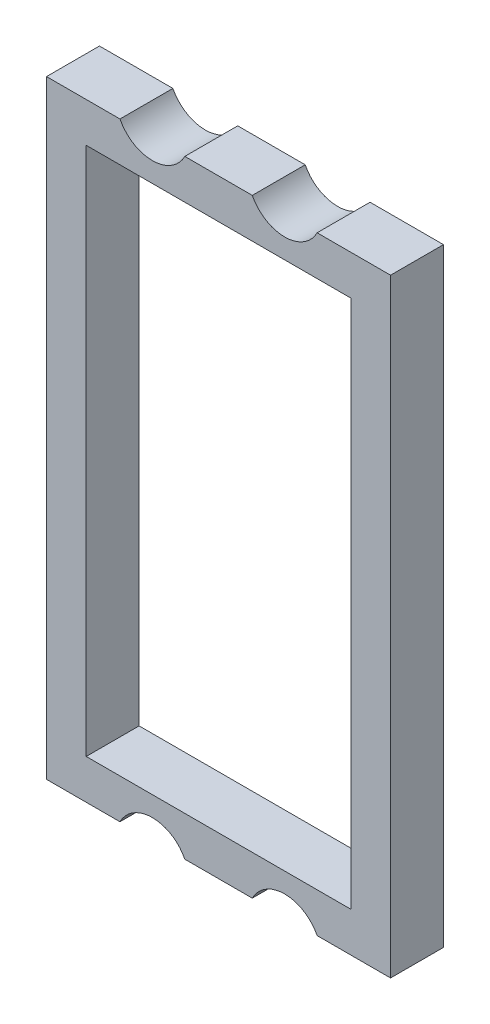
ISO-10303-21;
HEADER;
FILE_DESCRIPTION(('STEP AP214'),'2;1');
FILE_NAME('part.step','',(''),(''),'','','');
FILE_SCHEMA(('AUTOMOTIVE_DESIGN { 1 0 10303 214 1 1 1 1 }'));
ENDSEC;
DATA;
#1=APPLICATION_CONTEXT('core data for automotive mechanical design processes');
#2=APPLICATION_PROTOCOL_DEFINITION('international standard','automotive_design',2000,#1);
#3=PRODUCT_CONTEXT('',#1,'mechanical');
#4=PRODUCT('Part','Part','',(#3));
#5=PRODUCT_RELATED_PRODUCT_CATEGORY('part','',(#4));
#6=PRODUCT_DEFINITION_FORMATION('','',#4);
#7=PRODUCT_DEFINITION_CONTEXT('part definition',#1,'design');
#8=PRODUCT_DEFINITION('design','',#6,#7);
#9=PRODUCT_DEFINITION_SHAPE('','',#8);
#10=(LENGTH_UNIT() NAMED_UNIT(*) SI_UNIT(.MILLI.,.METRE.));
#11=(NAMED_UNIT(*) PLANE_ANGLE_UNIT() SI_UNIT($,.RADIAN.));
#12=(NAMED_UNIT(*) SI_UNIT($,.STERADIAN.) SOLID_ANGLE_UNIT());
#13=UNCERTAINTY_MEASURE_WITH_UNIT(LENGTH_MEASURE(1.E-05),#10,'distance_accuracy_value','');
#14=(GEOMETRIC_REPRESENTATION_CONTEXT(3) GLOBAL_UNCERTAINTY_ASSIGNED_CONTEXT((#13)) GLOBAL_UNIT_ASSIGNED_CONTEXT((#10,
#11,#12)) REPRESENTATION_CONTEXT('',''));
#15=CARTESIAN_POINT('',(0.,0.,0.));
#16=DIRECTION('',(0.,0.,1.));
#17=DIRECTION('',(1.,0.,0.));
#18=AXIS2_PLACEMENT_3D('',#15,#16,#17);
#19=CARTESIAN_POINT('',(0.,0.,0.));
#20=DIRECTION('',(0.,0.,1.));
#21=DIRECTION('',(0.,-1.,0.));
#22=AXIS2_PLACEMENT_3D('',#19,#20,#21);
#23=PLANE('',#22);
#24=DIRECTION('',(0.,1.,0.));
#25=VECTOR('',#24,1.);
#26=CARTESIAN_POINT('',(13.,-23.,0.));
#27=LINE('',#26,#25);
#28=CARTESIAN_POINT('',(13.,-23.,0.));
#29=VERTEX_POINT('',#28);
#30=CARTESIAN_POINT('',(13.,23.,0.));
#31=VERTEX_POINT('',#30);
#32=EDGE_CURVE('E25',#29,#31,#27,.T.);
#33=ORIENTED_EDGE('',*,*,#32,.F.);
#34=DIRECTION('',(1.,0.,0.));
#35=VECTOR('',#34,1.);
#36=CARTESIAN_POINT('',(7.44948974278318,-23.,0.));
#37=LINE('',#36,#35);
#38=CARTESIAN_POINT('',(7.44948974278318,-23.,0.));
#39=VERTEX_POINT('',#38);
#40=EDGE_CURVE('E34',#39,#29,#37,.T.);
#41=ORIENTED_EDGE('',*,*,#40,.F.);
#42=CARTESIAN_POINT('',(5.,-24.25,0.));
#43=DIRECTION('',(0.,0.,-1.));
#44=DIRECTION('',(-0.890723542830246,0.454545454545457,0.));
#45=AXIS2_PLACEMENT_3D('',#42,#43,#44);
#46=CIRCLE('',#45,2.75);
#47=CARTESIAN_POINT('',(2.55051025721682,-23.,0.));
#48=VERTEX_POINT('',#47);
#49=EDGE_CURVE('E185',#48,#39,#46,.T.);
#50=ORIENTED_EDGE('',*,*,#49,.F.);
#51=DIRECTION('',(1.,0.,0.));
#52=VECTOR('',#51,1.);
#53=CARTESIAN_POINT('',(-2.55051025721682,-23.,0.));
#54=LINE('',#53,#52);
#55=CARTESIAN_POINT('',(-2.55051025721682,-23.,0.));
#56=VERTEX_POINT('',#55);
#57=EDGE_CURVE('E190',#56,#48,#54,.T.);
#58=ORIENTED_EDGE('',*,*,#57,.F.);
#59=CARTESIAN_POINT('',(-5.,-24.25,0.));
#60=DIRECTION('',(0.,0.,-1.));
#61=DIRECTION('',(-0.890723542830245,0.454545454545458,0.));
#62=AXIS2_PLACEMENT_3D('',#59,#60,#61);
#63=CIRCLE('',#62,2.75);
#64=CARTESIAN_POINT('',(-7.44948974278318,-23.,0.));
#65=VERTEX_POINT('',#64);
#66=EDGE_CURVE('E198',#65,#56,#63,.T.);
#67=ORIENTED_EDGE('',*,*,#66,.F.);
#68=DIRECTION('',(1.,0.,0.));
#69=VECTOR('',#68,1.);
#70=CARTESIAN_POINT('',(-13.,-23.,0.));
#71=LINE('',#70,#69);
#72=CARTESIAN_POINT('',(-13.,-23.,0.));
#73=VERTEX_POINT('',#72);
#74=EDGE_CURVE('E214',#73,#65,#71,.T.);
#75=ORIENTED_EDGE('',*,*,#74,.F.);
#76=DIRECTION('',(0.,-1.,0.));
#77=VECTOR('',#76,1.);
#78=CARTESIAN_POINT('',(-13.,23.,0.));
#79=LINE('',#78,#77);
#80=CARTESIAN_POINT('',(-13.,23.,0.));
#81=VERTEX_POINT('',#80);
#82=EDGE_CURVE('E219',#81,#73,#79,.T.);
#83=ORIENTED_EDGE('',*,*,#82,.F.);
#84=DIRECTION('',(-1.,0.,0.));
#85=VECTOR('',#84,1.);
#86=CARTESIAN_POINT('',(-7.44948974278318,23.,0.));
#87=LINE('',#86,#85);
#88=CARTESIAN_POINT('',(-7.44948974278318,23.,0.));
#89=VERTEX_POINT('',#88);
#90=EDGE_CURVE('E277',#89,#81,#87,.T.);
#91=ORIENTED_EDGE('',*,*,#90,.F.);
#92=CARTESIAN_POINT('',(-5.,24.25,0.));
#93=DIRECTION('',(0.,0.,-1.));
#94=DIRECTION('',(0.890723542830245,-0.454545454545458,0.));
#95=AXIS2_PLACEMENT_3D('',#92,#93,#94);
#96=CIRCLE('',#95,2.75);
#97=CARTESIAN_POINT('',(-2.55051025721682,23.,0.));
#98=VERTEX_POINT('',#97);
#99=EDGE_CURVE('E228',#98,#89,#96,.T.);
#100=ORIENTED_EDGE('',*,*,#99,.F.);
#101=DIRECTION('',(-1.,0.,0.));
#102=VECTOR('',#101,1.);
#103=CARTESIAN_POINT('',(2.55051025721682,23.,0.));
#104=LINE('',#103,#102);
#105=CARTESIAN_POINT('',(2.55051025721682,23.,0.));
#106=VERTEX_POINT('',#105);
#107=EDGE_CURVE('E179',#106,#98,#104,.T.);
#108=ORIENTED_EDGE('',*,*,#107,.F.);
#109=CARTESIAN_POINT('',(5.,24.25,0.));
#110=DIRECTION('',(0.,0.,-1.));
#111=DIRECTION('',(0.890723542830245,-0.454545454545458,0.));
#112=AXIS2_PLACEMENT_3D('',#109,#110,#111);
#113=CIRCLE('',#112,2.75);
#114=CARTESIAN_POINT('',(7.44948974278318,23.,0.));
#115=VERTEX_POINT('',#114);
#116=EDGE_CURVE('E180',#115,#106,#113,.T.);
#117=ORIENTED_EDGE('',*,*,#116,.F.);
#118=DIRECTION('',(-1.,0.,0.));
#119=VECTOR('',#118,1.);
#120=CARTESIAN_POINT('',(13.,23.,0.));
#121=LINE('',#120,#119);
#122=EDGE_CURVE('E224',#31,#115,#121,.T.);
#123=ORIENTED_EDGE('',*,*,#122,.F.);
#124=EDGE_LOOP('',(#33,#41,#50,#58,#67,#75,#83,#91,#100,#108,#117,#123));
#125=FACE_BOUND('',#124,.T.);
#126=DIRECTION('',(-1.,0.,0.));
#127=VECTOR('',#126,1.);
#128=CARTESIAN_POINT('',(10.,-20.,0.));
#129=LINE('',#128,#127);
#130=CARTESIAN_POINT('',(10.,-20.,0.));
#131=VERTEX_POINT('',#130);
#132=CARTESIAN_POINT('',(-10.,-20.,0.));
#133=VERTEX_POINT('',#132);
#134=EDGE_CURVE('E268',#131,#133,#129,.T.);
#135=ORIENTED_EDGE('',*,*,#134,.F.);
#136=DIRECTION('',(0.,-1.,0.));
#137=VECTOR('',#136,1.);
#138=CARTESIAN_POINT('',(10.,20.,0.));
#139=LINE('',#138,#137);
#140=CARTESIAN_POINT('',(10.,20.,0.));
#141=VERTEX_POINT('',#140);
#142=EDGE_CURVE('E157',#141,#131,#139,.T.);
#143=ORIENTED_EDGE('',*,*,#142,.F.);
#144=DIRECTION('',(1.,0.,0.));
#145=VECTOR('',#144,1.);
#146=CARTESIAN_POINT('',(-10.,20.,0.));
#147=LINE('',#146,#145);
#148=CARTESIAN_POINT('',(-10.,20.,0.));
#149=VERTEX_POINT('',#148);
#150=EDGE_CURVE('E154',#149,#141,#147,.T.);
#151=ORIENTED_EDGE('',*,*,#150,.F.);
#152=DIRECTION('',(0.,1.,0.));
#153=VECTOR('',#152,1.);
#154=CARTESIAN_POINT('',(-10.,-20.,0.));
#155=LINE('',#154,#153);
#156=EDGE_CURVE('E201',#133,#149,#155,.T.);
#157=ORIENTED_EDGE('',*,*,#156,.F.);
#158=EDGE_LOOP('',(#135,#143,#151,#157));
#159=FACE_BOUND('',#158,.T.);
#160=ADVANCED_FACE('F14',(#125,#159),#23,.F.);
#161=CARTESIAN_POINT('',(13.,-23.,0.));
#162=DIRECTION('',(1.,0.,0.));
#163=DIRECTION('',(0.,1.,0.));
#164=AXIS2_PLACEMENT_3D('',#161,#162,#163);
#165=PLANE('',#164);
#166=DIRECTION('',(0.,0.,1.));
#167=VECTOR('',#166,1.);
#168=CARTESIAN_POINT('',(13.,23.,0.));
#169=LINE('',#168,#167);
#170=CARTESIAN_POINT('',(13.,23.,4.));
#171=VERTEX_POINT('',#170);
#172=EDGE_CURVE('E9',#31,#171,#169,.T.);
#173=ORIENTED_EDGE('',*,*,#172,.T.);
#174=DIRECTION('',(0.,1.,0.));
#175=VECTOR('',#174,1.);
#176=CARTESIAN_POINT('',(13.,-23.,4.));
#177=LINE('',#176,#175);
#178=CARTESIAN_POINT('',(13.,-23.,4.));
#179=VERTEX_POINT('',#178);
#180=EDGE_CURVE('E171',#179,#171,#177,.T.);
#181=ORIENTED_EDGE('',*,*,#180,.F.);
#182=DIRECTION('',(0.,0.,1.));
#183=VECTOR('',#182,1.);
#184=CARTESIAN_POINT('',(13.,-23.,0.));
#185=LINE('',#184,#183);
#186=EDGE_CURVE('E184',#29,#179,#185,.T.);
#187=ORIENTED_EDGE('',*,*,#186,.F.);
#188=ORIENTED_EDGE('',*,*,#32,.T.);
#189=EDGE_LOOP('',(#173,#181,#187,#188));
#190=FACE_BOUND('',#189,.T.);
#191=ADVANCED_FACE('F304',(#190),#165,.T.);
#192=CARTESIAN_POINT('',(7.44948974278318,-23.,0.));
#193=DIRECTION('',(0.,-1.,0.));
#194=DIRECTION('',(1.,0.,0.));
#195=AXIS2_PLACEMENT_3D('',#192,#193,#194);
#196=PLANE('',#195);
#197=ORIENTED_EDGE('',*,*,#186,.T.);
#198=DIRECTION('',(1.,0.,0.));
#199=VECTOR('',#198,1.);
#200=CARTESIAN_POINT('',(7.44948974278318,-23.,4.));
#201=LINE('',#200,#199);
#202=CARTESIAN_POINT('',(7.44948974278318,-23.,4.));
#203=VERTEX_POINT('',#202);
#204=EDGE_CURVE('E174',#203,#179,#201,.T.);
#205=ORIENTED_EDGE('',*,*,#204,.F.);
#206=DIRECTION('',(0.,0.,1.));
#207=VECTOR('',#206,1.);
#208=CARTESIAN_POINT('',(7.44948974278318,-23.,0.));
#209=LINE('',#208,#207);
#210=EDGE_CURVE('E188',#39,#203,#209,.T.);
#211=ORIENTED_EDGE('',*,*,#210,.F.);
#212=ORIENTED_EDGE('',*,*,#40,.T.);
#213=EDGE_LOOP('',(#197,#205,#211,#212));
#214=FACE_BOUND('',#213,.T.);
#215=ADVANCED_FACE('F309',(#214),#196,.T.);
#216=CARTESIAN_POINT('',(5.,-24.25,0.));
#217=DIRECTION('',(0.,0.,-1.));
#218=DIRECTION('',(0.,-1.,0.));
#219=AXIS2_PLACEMENT_3D('',#216,#217,#218);
#220=CYLINDRICAL_SURFACE('',#219,2.75);
#221=ORIENTED_EDGE('',*,*,#210,.T.);
#222=CARTESIAN_POINT('',(5.,-24.25,4.));
#223=DIRECTION('',(0.,0.,-1.));
#224=DIRECTION('',(-0.890723542830246,0.454545454545457,0.));
#225=AXIS2_PLACEMENT_3D('',#222,#223,#224);
#226=CIRCLE('',#225,2.75);
#227=CARTESIAN_POINT('',(2.55051025721682,-23.,4.));
#228=VERTEX_POINT('',#227);
#229=EDGE_CURVE('E55',#228,#203,#226,.T.);
#230=ORIENTED_EDGE('',*,*,#229,.F.);
#231=DIRECTION('',(0.,0.,1.));
#232=VECTOR('',#231,1.);
#233=CARTESIAN_POINT('',(2.55051025721682,-23.,0.));
#234=LINE('',#233,#232);
#235=EDGE_CURVE('E189',#48,#228,#234,.T.);
#236=ORIENTED_EDGE('',*,*,#235,.F.);
#237=ORIENTED_EDGE('',*,*,#49,.T.);
#238=EDGE_LOOP('',(#221,#230,#236,#237));
#239=FACE_BOUND('',#238,.T.);
#240=ADVANCED_FACE('F341',(#239),#220,.F.);
#241=CARTESIAN_POINT('',(-2.55051025721682,-23.,0.));
#242=DIRECTION('',(0.,-1.,0.));
#243=DIRECTION('',(1.,0.,0.));
#244=AXIS2_PLACEMENT_3D('',#241,#242,#243);
#245=PLANE('',#244);
#246=ORIENTED_EDGE('',*,*,#235,.T.);
#247=DIRECTION('',(1.,0.,0.));
#248=VECTOR('',#247,1.);
#249=CARTESIAN_POINT('',(-2.55051025721682,-23.,4.));
#250=LINE('',#249,#248);
#251=CARTESIAN_POINT('',(-2.55051025721682,-23.,4.));
#252=VERTEX_POINT('',#251);
#253=EDGE_CURVE('E66',#252,#228,#250,.T.);
#254=ORIENTED_EDGE('',*,*,#253,.F.);
#255=DIRECTION('',(0.,0.,1.));
#256=VECTOR('',#255,1.);
#257=CARTESIAN_POINT('',(-2.55051025721682,-23.,0.));
#258=LINE('',#257,#256);
#259=EDGE_CURVE('E193',#56,#252,#258,.T.);
#260=ORIENTED_EDGE('',*,*,#259,.F.);
#261=ORIENTED_EDGE('',*,*,#57,.T.);
#262=EDGE_LOOP('',(#246,#254,#260,#261));
#263=FACE_BOUND('',#262,.T.);
#264=ADVANCED_FACE('F346',(#263),#245,.T.);
#265=CARTESIAN_POINT('',(-5.,-24.25,0.));
#266=DIRECTION('',(0.,0.,-1.));
#267=DIRECTION('',(0.,-1.,0.));
#268=AXIS2_PLACEMENT_3D('',#265,#266,#267);
#269=CYLINDRICAL_SURFACE('',#268,2.75);
#270=ORIENTED_EDGE('',*,*,#259,.T.);
#271=CARTESIAN_POINT('',(-5.,-24.25,4.));
#272=DIRECTION('',(0.,0.,-1.));
#273=DIRECTION('',(-0.890723542830245,0.454545454545458,0.));
#274=AXIS2_PLACEMENT_3D('',#271,#272,#273);
#275=CIRCLE('',#274,2.75);
#276=CARTESIAN_POINT('',(-7.44948974278318,-23.,4.));
#277=VERTEX_POINT('',#276);
#278=EDGE_CURVE('E242',#277,#252,#275,.T.);
#279=ORIENTED_EDGE('',*,*,#278,.F.);
#280=DIRECTION('',(0.,0.,1.));
#281=VECTOR('',#280,1.);
#282=CARTESIAN_POINT('',(-7.44948974278318,-23.,0.));
#283=LINE('',#282,#281);
#284=EDGE_CURVE('E210',#65,#277,#283,.T.);
#285=ORIENTED_EDGE('',*,*,#284,.F.);
#286=ORIENTED_EDGE('',*,*,#66,.T.);
#287=EDGE_LOOP('',(#270,#279,#285,#286));
#288=FACE_BOUND('',#287,.T.);
#289=ADVANCED_FACE('F366',(#288),#269,.F.);
#290=CARTESIAN_POINT('',(-13.,-23.,0.));
#291=DIRECTION('',(0.,-1.,0.));
#292=DIRECTION('',(1.,0.,0.));
#293=AXIS2_PLACEMENT_3D('',#290,#291,#292);
#294=PLANE('',#293);
#295=ORIENTED_EDGE('',*,*,#284,.T.);
#296=DIRECTION('',(1.,0.,0.));
#297=VECTOR('',#296,1.);
#298=CARTESIAN_POINT('',(-13.,-23.,4.));
#299=LINE('',#298,#297);
#300=CARTESIAN_POINT('',(-13.,-23.,4.));
#301=VERTEX_POINT('',#300);
#302=EDGE_CURVE('E246',#301,#277,#299,.T.);
#303=ORIENTED_EDGE('',*,*,#302,.F.);
#304=DIRECTION('',(0.,0.,1.));
#305=VECTOR('',#304,1.);
#306=CARTESIAN_POINT('',(-13.,-23.,0.));
#307=LINE('',#306,#305);
#308=EDGE_CURVE('E215',#73,#301,#307,.T.);
#309=ORIENTED_EDGE('',*,*,#308,.F.);
#310=ORIENTED_EDGE('',*,*,#74,.T.);
#311=EDGE_LOOP('',(#295,#303,#309,#310));
#312=FACE_BOUND('',#311,.T.);
#313=ADVANCED_FACE('F360',(#312),#294,.T.);
#314=CARTESIAN_POINT('',(-13.,23.,0.));
#315=DIRECTION('',(-1.,0.,0.));
#316=DIRECTION('',(0.,-1.,0.));
#317=AXIS2_PLACEMENT_3D('',#314,#315,#316);
#318=PLANE('',#317);
#319=ORIENTED_EDGE('',*,*,#308,.T.);
#320=DIRECTION('',(0.,-1.,0.));
#321=VECTOR('',#320,1.);
#322=CARTESIAN_POINT('',(-13.,23.,4.));
#323=LINE('',#322,#321);
#324=CARTESIAN_POINT('',(-13.,23.,4.));
#325=VERTEX_POINT('',#324);
#326=EDGE_CURVE('E251',#325,#301,#323,.T.);
#327=ORIENTED_EDGE('',*,*,#326,.F.);
#328=DIRECTION('',(0.,0.,1.));
#329=VECTOR('',#328,1.);
#330=CARTESIAN_POINT('',(-13.,23.,0.));
#331=LINE('',#330,#329);
#332=EDGE_CURVE('E257',#81,#325,#331,.T.);
#333=ORIENTED_EDGE('',*,*,#332,.F.);
#334=ORIENTED_EDGE('',*,*,#82,.T.);
#335=EDGE_LOOP('',(#319,#327,#333,#334));
#336=FACE_BOUND('',#335,.T.);
#337=ADVANCED_FACE('F365',(#336),#318,.T.);
#338=CARTESIAN_POINT('',(-7.44948974278318,23.,0.));
#339=DIRECTION('',(0.,1.,0.));
#340=DIRECTION('',(-1.,0.,0.));
#341=AXIS2_PLACEMENT_3D('',#338,#339,#340);
#342=PLANE('',#341);
#343=ORIENTED_EDGE('',*,*,#332,.T.);
#344=DIRECTION('',(-1.,0.,0.));
#345=VECTOR('',#344,1.);
#346=CARTESIAN_POINT('',(-7.44948974278318,23.,4.));
#347=LINE('',#346,#345);
#348=CARTESIAN_POINT('',(-7.44948974278318,23.,4.));
#349=VERTEX_POINT('',#348);
#350=EDGE_CURVE('E254',#349,#325,#347,.T.);
#351=ORIENTED_EDGE('',*,*,#350,.F.);
#352=DIRECTION('',(0.,0.,1.));
#353=VECTOR('',#352,1.);
#354=CARTESIAN_POINT('',(-7.44948974278318,23.,0.));
#355=LINE('',#354,#353);
#356=EDGE_CURVE('E276',#89,#349,#355,.T.);
#357=ORIENTED_EDGE('',*,*,#356,.F.);
#358=ORIENTED_EDGE('',*,*,#90,.T.);
#359=EDGE_LOOP('',(#343,#351,#357,#358));
#360=FACE_BOUND('',#359,.T.);
#361=ADVANCED_FACE('F389',(#360),#342,.T.);
#362=CARTESIAN_POINT('',(-5.,24.25,0.));
#363=DIRECTION('',(0.,0.,-1.));
#364=DIRECTION('',(0.,-1.,0.));
#365=AXIS2_PLACEMENT_3D('',#362,#363,#364);
#366=CYLINDRICAL_SURFACE('',#365,2.75);
#367=ORIENTED_EDGE('',*,*,#356,.T.);
#368=CARTESIAN_POINT('',(-5.,24.25,4.));
#369=DIRECTION('',(0.,0.,-1.));
#370=DIRECTION('',(0.890723542830245,-0.454545454545458,0.));
#371=AXIS2_PLACEMENT_3D('',#368,#369,#370);
#372=CIRCLE('',#371,2.75);
#373=CARTESIAN_POINT('',(-2.55051025721682,23.,4.));
#374=VERTEX_POINT('',#373);
#375=EDGE_CURVE('E259',#374,#349,#372,.T.);
#376=ORIENTED_EDGE('',*,*,#375,.F.);
#377=DIRECTION('',(0.,0.,1.));
#378=VECTOR('',#377,1.);
#379=CARTESIAN_POINT('',(-2.55051025721682,23.,0.));
#380=LINE('',#379,#378);
#381=EDGE_CURVE('E209',#98,#374,#380,.T.);
#382=ORIENTED_EDGE('',*,*,#381,.F.);
#383=ORIENTED_EDGE('',*,*,#99,.T.);
#384=EDGE_LOOP('',(#367,#376,#382,#383));
#385=FACE_BOUND('',#384,.T.);
#386=ADVANCED_FACE('F16',(#385),#366,.F.);
#387=CARTESIAN_POINT('',(2.55051025721682,23.,0.));
#388=DIRECTION('',(0.,1.,0.));
#389=DIRECTION('',(-1.,0.,0.));
#390=AXIS2_PLACEMENT_3D('',#387,#388,#389);
#391=PLANE('',#390);
#392=ORIENTED_EDGE('',*,*,#381,.T.);
#393=DIRECTION('',(-1.,0.,0.));
#394=VECTOR('',#393,1.);
#395=CARTESIAN_POINT('',(2.55051025721682,23.,4.));
#396=LINE('',#395,#394);
#397=CARTESIAN_POINT('',(2.55051025721682,23.,4.));
#398=VERTEX_POINT('',#397);
#399=EDGE_CURVE('E263',#398,#374,#396,.T.);
#400=ORIENTED_EDGE('',*,*,#399,.F.);
#401=DIRECTION('',(0.,0.,1.));
#402=VECTOR('',#401,1.);
#403=CARTESIAN_POINT('',(2.55051025721682,23.,0.));
#404=LINE('',#403,#402);
#405=EDGE_CURVE('E176',#106,#398,#404,.T.);
#406=ORIENTED_EDGE('',*,*,#405,.F.);
#407=ORIENTED_EDGE('',*,*,#107,.T.);
#408=EDGE_LOOP('',(#392,#400,#406,#407));
#409=FACE_BOUND('',#408,.T.);
#410=ADVANCED_FACE('F323',(#409),#391,.T.);
#411=CARTESIAN_POINT('',(5.,24.25,0.));
#412=DIRECTION('',(0.,0.,-1.));
#413=DIRECTION('',(0.,-1.,0.));
#414=AXIS2_PLACEMENT_3D('',#411,#412,#413);
#415=CYLINDRICAL_SURFACE('',#414,2.75);
#416=ORIENTED_EDGE('',*,*,#405,.T.);
#417=CARTESIAN_POINT('',(5.,24.25,4.));
#418=DIRECTION('',(0.,0.,-1.));
#419=DIRECTION('',(0.890723542830245,-0.454545454545458,0.));
#420=AXIS2_PLACEMENT_3D('',#417,#418,#419);
#421=CIRCLE('',#420,2.75);
#422=CARTESIAN_POINT('',(7.44948974278318,23.,4.));
#423=VERTEX_POINT('',#422);
#424=EDGE_CURVE('E206',#423,#398,#421,.T.);
#425=ORIENTED_EDGE('',*,*,#424,.F.);
#426=DIRECTION('',(0.,0.,1.));
#427=VECTOR('',#426,1.);
#428=CARTESIAN_POINT('',(7.44948974278318,23.,0.));
#429=LINE('',#428,#427);
#430=EDGE_CURVE('E220',#115,#423,#429,.T.);
#431=ORIENTED_EDGE('',*,*,#430,.F.);
#432=ORIENTED_EDGE('',*,*,#116,.T.);
#433=EDGE_LOOP('',(#416,#425,#431,#432));
#434=FACE_BOUND('',#433,.T.);
#435=ADVANCED_FACE('F317',(#434),#415,.F.);
#436=CARTESIAN_POINT('',(13.,23.,0.));
#437=DIRECTION('',(0.,1.,0.));
#438=DIRECTION('',(-1.,0.,0.));
#439=AXIS2_PLACEMENT_3D('',#436,#437,#438);
#440=PLANE('',#439);
#441=ORIENTED_EDGE('',*,*,#430,.T.);
#442=DIRECTION('',(-1.,0.,0.));
#443=VECTOR('',#442,1.);
#444=CARTESIAN_POINT('',(13.,23.,4.));
#445=LINE('',#444,#443);
#446=EDGE_CURVE('E18',#171,#423,#445,.T.);
#447=ORIENTED_EDGE('',*,*,#446,.F.);
#448=ORIENTED_EDGE('',*,*,#172,.F.);
#449=ORIENTED_EDGE('',*,*,#122,.T.);
#450=EDGE_LOOP('',(#441,#447,#448,#449));
#451=FACE_BOUND('',#450,.T.);
#452=ADVANCED_FACE('F322',(#451),#440,.T.);
#453=CARTESIAN_POINT('',(10.,-20.,0.));
#454=DIRECTION('',(0.,1.,0.));
#455=DIRECTION('',(-1.,0.,0.));
#456=AXIS2_PLACEMENT_3D('',#453,#454,#455);
#457=PLANE('',#456);
#458=DIRECTION('',(0.,0.,1.));
#459=VECTOR('',#458,1.);
#460=CARTESIAN_POINT('',(-10.,-20.,0.));
#461=LINE('',#460,#459);
#462=CARTESIAN_POINT('',(-10.,-20.,4.));
#463=VERTEX_POINT('',#462);
#464=EDGE_CURVE('E231',#133,#463,#461,.T.);
#465=ORIENTED_EDGE('',*,*,#464,.T.);
#466=DIRECTION('',(-1.,0.,0.));
#467=VECTOR('',#466,1.);
#468=CARTESIAN_POINT('',(10.,-20.,4.));
#469=LINE('',#468,#467);
#470=CARTESIAN_POINT('',(10.,-20.,4.));
#471=VERTEX_POINT('',#470);
#472=EDGE_CURVE('E147',#471,#463,#469,.T.);
#473=ORIENTED_EDGE('',*,*,#472,.F.);
#474=DIRECTION('',(0.,0.,1.));
#475=VECTOR('',#474,1.);
#476=CARTESIAN_POINT('',(10.,-20.,0.));
#477=LINE('',#476,#475);
#478=EDGE_CURVE('E142',#131,#471,#477,.T.);
#479=ORIENTED_EDGE('',*,*,#478,.F.);
#480=ORIENTED_EDGE('',*,*,#134,.T.);
#481=EDGE_LOOP('',(#465,#473,#479,#480));
#482=FACE_BOUND('',#481,.T.);
#483=ADVANCED_FACE('F355',(#482),#457,.T.);
#484=CARTESIAN_POINT('',(10.,20.,0.));
#485=DIRECTION('',(-1.,0.,0.));
#486=DIRECTION('',(0.,-1.,0.));
#487=AXIS2_PLACEMENT_3D('',#484,#485,#486);
#488=PLANE('',#487);
#489=ORIENTED_EDGE('',*,*,#478,.T.);
#490=DIRECTION('',(0.,-1.,0.));
#491=VECTOR('',#490,1.);
#492=CARTESIAN_POINT('',(10.,20.,4.));
#493=LINE('',#492,#491);
#494=CARTESIAN_POINT('',(10.,20.,4.));
#495=VERTEX_POINT('',#494);
#496=EDGE_CURVE('E137',#495,#471,#493,.T.);
#497=ORIENTED_EDGE('',*,*,#496,.F.);
#498=DIRECTION('',(0.,0.,1.));
#499=VECTOR('',#498,1.);
#500=CARTESIAN_POINT('',(10.,20.,0.));
#501=LINE('',#500,#499);
#502=EDGE_CURVE('E140',#141,#495,#501,.T.);
#503=ORIENTED_EDGE('',*,*,#502,.F.);
#504=ORIENTED_EDGE('',*,*,#142,.T.);
#505=EDGE_LOOP('',(#489,#497,#503,#504));
#506=FACE_BOUND('',#505,.T.);
#507=ADVANCED_FACE('F139',(#506),#488,.T.);
#508=CARTESIAN_POINT('',(-10.,20.,0.));
#509=DIRECTION('',(0.,-1.,0.));
#510=DIRECTION('',(1.,0.,0.));
#511=AXIS2_PLACEMENT_3D('',#508,#509,#510);
#512=PLANE('',#511);
#513=ORIENTED_EDGE('',*,*,#502,.T.);
#514=DIRECTION('',(1.,0.,0.));
#515=VECTOR('',#514,1.);
#516=CARTESIAN_POINT('',(-10.,20.,4.));
#517=LINE('',#516,#515);
#518=CARTESIAN_POINT('',(-10.,20.,4.));
#519=VERTEX_POINT('',#518);
#520=EDGE_CURVE('E146',#519,#495,#517,.T.);
#521=ORIENTED_EDGE('',*,*,#520,.F.);
#522=DIRECTION('',(0.,0.,1.));
#523=VECTOR('',#522,1.);
#524=CARTESIAN_POINT('',(-10.,20.,0.));
#525=LINE('',#524,#523);
#526=EDGE_CURVE('E205',#149,#519,#525,.T.);
#527=ORIENTED_EDGE('',*,*,#526,.F.);
#528=ORIENTED_EDGE('',*,*,#150,.T.);
#529=EDGE_LOOP('',(#513,#521,#527,#528));
#530=FACE_BOUND('',#529,.T.);
#531=ADVANCED_FACE('F150',(#530),#512,.T.);
#532=CARTESIAN_POINT('',(-10.,-20.,0.));
#533=DIRECTION('',(1.,0.,0.));
#534=DIRECTION('',(0.,1.,0.));
#535=AXIS2_PLACEMENT_3D('',#532,#533,#534);
#536=PLANE('',#535);
#537=ORIENTED_EDGE('',*,*,#526,.T.);
#538=DIRECTION('',(0.,1.,0.));
#539=VECTOR('',#538,1.);
#540=CARTESIAN_POINT('',(-10.,-20.,4.));
#541=LINE('',#540,#539);
#542=EDGE_CURVE('E162',#463,#519,#541,.T.);
#543=ORIENTED_EDGE('',*,*,#542,.F.);
#544=ORIENTED_EDGE('',*,*,#464,.F.);
#545=ORIENTED_EDGE('',*,*,#156,.T.);
#546=EDGE_LOOP('',(#537,#543,#544,#545));
#547=FACE_BOUND('',#546,.T.);
#548=ADVANCED_FACE('F330',(#547),#536,.T.);
#549=CARTESIAN_POINT('',(0.,0.,4.));
#550=DIRECTION('',(0.,0.,1.));
#551=DIRECTION('',(0.,-1.,0.));
#552=AXIS2_PLACEMENT_3D('',#549,#550,#551);
#553=PLANE('',#552);
#554=ORIENTED_EDGE('',*,*,#424,.T.);
#555=ORIENTED_EDGE('',*,*,#399,.T.);
#556=ORIENTED_EDGE('',*,*,#375,.T.);
#557=ORIENTED_EDGE('',*,*,#350,.T.);
#558=ORIENTED_EDGE('',*,*,#326,.T.);
#559=ORIENTED_EDGE('',*,*,#302,.T.);
#560=ORIENTED_EDGE('',*,*,#278,.T.);
#561=ORIENTED_EDGE('',*,*,#253,.T.);
#562=ORIENTED_EDGE('',*,*,#229,.T.);
#563=ORIENTED_EDGE('',*,*,#204,.T.);
#564=ORIENTED_EDGE('',*,*,#180,.T.);
#565=ORIENTED_EDGE('',*,*,#446,.T.);
#566=EDGE_LOOP('',(#554,#555,#556,#557,#558,#559,#560,#561,#562,#563,#564,#565));
#567=FACE_BOUND('',#566,.T.);
#568=ORIENTED_EDGE('',*,*,#520,.T.);
#569=ORIENTED_EDGE('',*,*,#496,.T.);
#570=ORIENTED_EDGE('',*,*,#472,.T.);
#571=ORIENTED_EDGE('',*,*,#542,.T.);
#572=EDGE_LOOP('',(#568,#569,#570,#571));
#573=FACE_BOUND('',#572,.T.);
#574=ADVANCED_FACE('F160',(#567,#573),#553,.T.);
#575=CLOSED_SHELL('',(#160,#191,#215,#240,#264,#289,#313,#337,#361,#386,#410,#435,#452,#483,
#507,#531,#548,#574));
#576=MANIFOLD_SOLID_BREP('B1',#575);
#577=ADVANCED_BREP_SHAPE_REPRESENTATION('',(#18,#576),#14);
#578=SHAPE_DEFINITION_REPRESENTATION(#9,#577);
ENDSEC;
END-ISO-10303-21;
